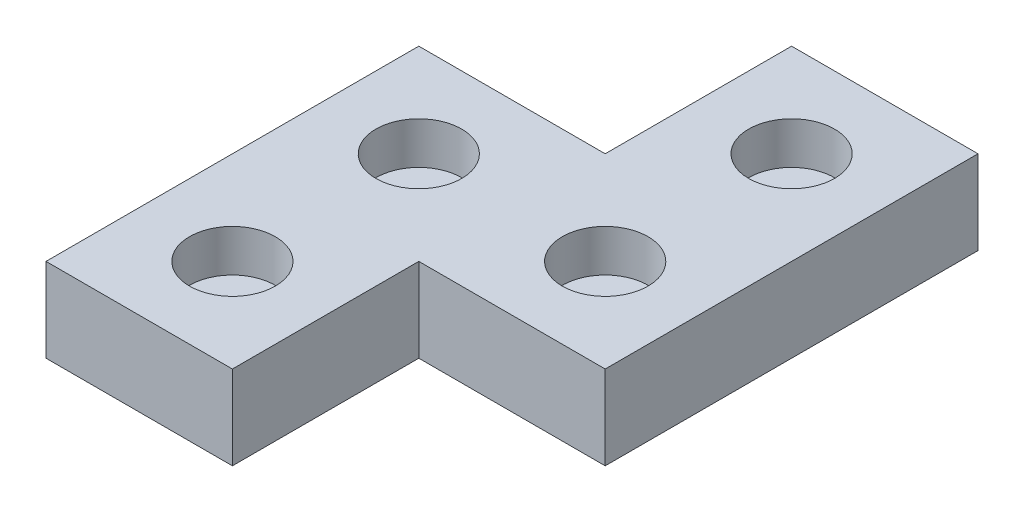
ISO-10303-21;
HEADER;
FILE_DESCRIPTION(('STEP AP214'),'2;1');
FILE_NAME('part.step','',(''),(''),'','','');
FILE_SCHEMA(('AUTOMOTIVE_DESIGN { 1 0 10303 214 1 1 1 1 }'));
ENDSEC;
DATA;
#1=APPLICATION_CONTEXT('core data for automotive mechanical design processes');
#2=APPLICATION_PROTOCOL_DEFINITION('international standard','automotive_design',2000,#1);
#3=PRODUCT_CONTEXT('',#1,'mechanical');
#4=PRODUCT('Part','Part','',(#3));
#5=PRODUCT_RELATED_PRODUCT_CATEGORY('part','',(#4));
#6=PRODUCT_DEFINITION_FORMATION('','',#4);
#7=PRODUCT_DEFINITION_CONTEXT('part definition',#1,'design');
#8=PRODUCT_DEFINITION('design','',#6,#7);
#9=PRODUCT_DEFINITION_SHAPE('','',#8);
#10=(LENGTH_UNIT() NAMED_UNIT(*) SI_UNIT(.MILLI.,.METRE.));
#11=(NAMED_UNIT(*) PLANE_ANGLE_UNIT() SI_UNIT($,.RADIAN.));
#12=(NAMED_UNIT(*) SI_UNIT($,.STERADIAN.) SOLID_ANGLE_UNIT());
#13=UNCERTAINTY_MEASURE_WITH_UNIT(LENGTH_MEASURE(1.E-05),#10,'distance_accuracy_value','');
#14=(GEOMETRIC_REPRESENTATION_CONTEXT(3) GLOBAL_UNCERTAINTY_ASSIGNED_CONTEXT((#13)) GLOBAL_UNIT_ASSIGNED_CONTEXT((#10,
#11,#12)) REPRESENTATION_CONTEXT('',''));
#15=CARTESIAN_POINT('',(0.,0.,0.));
#16=DIRECTION('',(0.,0.,1.));
#17=DIRECTION('',(1.,0.,0.));
#18=AXIS2_PLACEMENT_3D('',#15,#16,#17);
#19=CARTESIAN_POINT('',(-55.0675765364658,5.715,9.80298613010364));
#20=DIRECTION('',(0.,0.,1.));
#21=DIRECTION('',(-1.,0.,0.));
#22=AXIS2_PLACEMENT_3D('',#19,#20,#21);
#23=PLANE('',#22);
#24=DIRECTION('',(1.,0.,0.));
#25=VECTOR('',#24,1.);
#26=CARTESIAN_POINT('',(-55.0675765364658,0.,9.80298613010364));
#27=LINE('',#26,#25);
#28=CARTESIAN_POINT('',(-55.0675765364658,0.,9.80298613010364));
#29=VERTEX_POINT('',#28);
#30=CARTESIAN_POINT('',(-42.3675765364658,0.,9.80298613010364));
#31=VERTEX_POINT('',#30);
#32=EDGE_CURVE('E135',#29,#31,#27,.T.);
#33=ORIENTED_EDGE('',*,*,#32,.T.);
#34=DIRECTION('',(0.,-1.,0.));
#35=VECTOR('',#34,1.);
#36=CARTESIAN_POINT('',(-42.3675765364658,5.715,9.80298613010364));
#37=LINE('',#36,#35);
#38=CARTESIAN_POINT('',(-42.3675765364658,5.715,9.80298613010364));
#39=VERTEX_POINT('',#38);
#40=EDGE_CURVE('E42',#39,#31,#37,.T.);
#41=ORIENTED_EDGE('',*,*,#40,.F.);
#42=DIRECTION('',(1.,0.,0.));
#43=VECTOR('',#42,1.);
#44=CARTESIAN_POINT('',(-55.0675765364658,5.715,9.80298613010364));
#45=LINE('',#44,#43);
#46=CARTESIAN_POINT('',(-55.0675765364658,5.715,9.80298613010364));
#47=VERTEX_POINT('',#46);
#48=EDGE_CURVE('E149',#47,#39,#45,.T.);
#49=ORIENTED_EDGE('',*,*,#48,.F.);
#50=DIRECTION('',(0.,-1.,0.));
#51=VECTOR('',#50,1.);
#52=CARTESIAN_POINT('',(-55.0675765364658,5.715,9.80298613010364));
#53=LINE('',#52,#51);
#54=EDGE_CURVE('E11',#47,#29,#53,.T.);
#55=ORIENTED_EDGE('',*,*,#54,.T.);
#56=EDGE_LOOP('',(#33,#41,#49,#55));
#57=FACE_BOUND('',#56,.T.);
#58=ADVANCED_FACE('F39',(#57),#23,.T.);
#59=CARTESIAN_POINT('',(-55.0675765364658,5.715,22.5029861301036));
#60=DIRECTION('',(1.,0.,0.));
#61=DIRECTION('',(0.,0.,1.));
#62=AXIS2_PLACEMENT_3D('',#59,#60,#61);
#63=PLANE('',#62);
#64=DIRECTION('',(0.,0.,-1.));
#65=VECTOR('',#64,1.);
#66=CARTESIAN_POINT('',(-55.0675765364658,0.,22.5029861301036));
#67=LINE('',#66,#65);
#68=CARTESIAN_POINT('',(-55.0675765364658,0.,22.5029861301036));
#69=VERTEX_POINT('',#68);
#70=EDGE_CURVE('E92',#69,#29,#67,.T.);
#71=ORIENTED_EDGE('',*,*,#70,.T.);
#72=ORIENTED_EDGE('',*,*,#54,.F.);
#73=DIRECTION('',(0.,0.,-1.));
#74=VECTOR('',#73,1.);
#75=CARTESIAN_POINT('',(-55.0675765364658,5.715,22.5029861301036));
#76=LINE('',#75,#74);
#77=CARTESIAN_POINT('',(-55.0675765364658,5.715,22.5029861301036));
#78=VERTEX_POINT('',#77);
#79=EDGE_CURVE('E57',#78,#47,#76,.T.);
#80=ORIENTED_EDGE('',*,*,#79,.F.);
#81=DIRECTION('',(0.,-1.,0.));
#82=VECTOR('',#81,1.);
#83=CARTESIAN_POINT('',(-55.0675765364658,5.715,22.5029861301036));
#84=LINE('',#83,#82);
#85=EDGE_CURVE('E48',#78,#69,#84,.T.);
#86=ORIENTED_EDGE('',*,*,#85,.T.);
#87=EDGE_LOOP('',(#71,#72,#80,#86));
#88=FACE_BOUND('',#87,.T.);
#89=ADVANCED_FACE('F221',(#88),#63,.T.);
#90=CARTESIAN_POINT('',(-67.7675765364658,5.715,22.5029861301036));
#91=DIRECTION('',(0.,0.,1.));
#92=DIRECTION('',(-1.,0.,0.));
#93=AXIS2_PLACEMENT_3D('',#90,#91,#92);
#94=PLANE('',#93);
#95=DIRECTION('',(1.,0.,0.));
#96=VECTOR('',#95,1.);
#97=CARTESIAN_POINT('',(-67.7675765364658,0.,22.5029861301036));
#98=LINE('',#97,#96);
#99=CARTESIAN_POINT('',(-67.7675765364658,0.,22.5029861301036));
#100=VERTEX_POINT('',#99);
#101=EDGE_CURVE('E86',#100,#69,#98,.T.);
#102=ORIENTED_EDGE('',*,*,#101,.T.);
#103=ORIENTED_EDGE('',*,*,#85,.F.);
#104=DIRECTION('',(1.,0.,0.));
#105=VECTOR('',#104,1.);
#106=CARTESIAN_POINT('',(-67.7675765364658,5.715,22.5029861301036));
#107=LINE('',#106,#105);
#108=CARTESIAN_POINT('',(-67.7675765364658,5.715,22.5029861301036));
#109=VERTEX_POINT('',#108);
#110=EDGE_CURVE('E117',#109,#78,#107,.T.);
#111=ORIENTED_EDGE('',*,*,#110,.F.);
#112=DIRECTION('',(0.,-1.,0.));
#113=VECTOR('',#112,1.);
#114=CARTESIAN_POINT('',(-67.7675765364658,5.715,22.5029861301036));
#115=LINE('',#114,#113);
#116=EDGE_CURVE('E124',#109,#100,#115,.T.);
#117=ORIENTED_EDGE('',*,*,#116,.T.);
#118=EDGE_LOOP('',(#102,#103,#111,#117));
#119=FACE_BOUND('',#118,.T.);
#120=ADVANCED_FACE('F130',(#119),#94,.T.);
#121=CARTESIAN_POINT('',(-67.7675765364658,5.715,-2.89701386989635));
#122=DIRECTION('',(-1.,0.,0.));
#123=DIRECTION('',(0.,0.,-1.));
#124=AXIS2_PLACEMENT_3D('',#121,#122,#123);
#125=PLANE('',#124);
#126=DIRECTION('',(0.,0.,1.));
#127=VECTOR('',#126,1.);
#128=CARTESIAN_POINT('',(-67.7675765364658,0.,-2.89701386989635));
#129=LINE('',#128,#127);
#130=CARTESIAN_POINT('',(-67.7675765364658,0.,-2.89701386989635));
#131=VERTEX_POINT('',#130);
#132=EDGE_CURVE('E127',#131,#100,#129,.T.);
#133=ORIENTED_EDGE('',*,*,#132,.T.);
#134=ORIENTED_EDGE('',*,*,#116,.F.);
#135=DIRECTION('',(0.,0.,1.));
#136=VECTOR('',#135,1.);
#137=CARTESIAN_POINT('',(-67.7675765364658,5.715,-2.89701386989635));
#138=LINE('',#137,#136);
#139=CARTESIAN_POINT('',(-67.7675765364658,5.715,-2.89701386989635));
#140=VERTEX_POINT('',#139);
#141=EDGE_CURVE('E113',#140,#109,#138,.T.);
#142=ORIENTED_EDGE('',*,*,#141,.F.);
#143=DIRECTION('',(0.,-1.,0.));
#144=VECTOR('',#143,1.);
#145=CARTESIAN_POINT('',(-67.7675765364658,5.715,-2.89701386989635));
#146=LINE('',#145,#144);
#147=EDGE_CURVE('E128',#140,#131,#146,.T.);
#148=ORIENTED_EDGE('',*,*,#147,.T.);
#149=EDGE_LOOP('',(#133,#134,#142,#148));
#150=FACE_BOUND('',#149,.T.);
#151=ADVANCED_FACE('F125',(#150),#125,.T.);
#152=CARTESIAN_POINT('',(-55.0675765364658,5.715,-2.89701386989635));
#153=DIRECTION('',(0.,0.,-1.));
#154=DIRECTION('',(1.,0.,0.));
#155=AXIS2_PLACEMENT_3D('',#152,#153,#154);
#156=PLANE('',#155);
#157=DIRECTION('',(-1.,0.,0.));
#158=VECTOR('',#157,1.);
#159=CARTESIAN_POINT('',(-55.0675765364658,0.,-2.89701386989635));
#160=LINE('',#159,#158);
#161=CARTESIAN_POINT('',(-55.0675765364658,0.,-2.89701386989635));
#162=VERTEX_POINT('',#161);
#163=EDGE_CURVE('E145',#162,#131,#160,.T.);
#164=ORIENTED_EDGE('',*,*,#163,.T.);
#165=ORIENTED_EDGE('',*,*,#147,.F.);
#166=DIRECTION('',(-1.,0.,0.));
#167=VECTOR('',#166,1.);
#168=CARTESIAN_POINT('',(-55.0675765364658,5.715,-2.89701386989635));
#169=LINE('',#168,#167);
#170=CARTESIAN_POINT('',(-55.0675765364658,5.715,-2.89701386989635));
#171=VERTEX_POINT('',#170);
#172=EDGE_CURVE('E119',#171,#140,#169,.T.);
#173=ORIENTED_EDGE('',*,*,#172,.F.);
#174=DIRECTION('',(0.,-1.,0.));
#175=VECTOR('',#174,1.);
#176=CARTESIAN_POINT('',(-55.0675765364658,5.715,-2.89701386989635));
#177=LINE('',#176,#175);
#178=EDGE_CURVE('E153',#171,#162,#177,.T.);
#179=ORIENTED_EDGE('',*,*,#178,.T.);
#180=EDGE_LOOP('',(#164,#165,#173,#179));
#181=FACE_BOUND('',#180,.T.);
#182=ADVANCED_FACE('F235',(#181),#156,.T.);
#183=CARTESIAN_POINT('',(-55.0675765364658,5.715,-15.5970138698964));
#184=DIRECTION('',(-1.,0.,0.));
#185=DIRECTION('',(0.,0.,-1.));
#186=AXIS2_PLACEMENT_3D('',#183,#184,#185);
#187=PLANE('',#186);
#188=DIRECTION('',(0.,0.,1.));
#189=VECTOR('',#188,1.);
#190=CARTESIAN_POINT('',(-55.0675765364658,0.,-15.5970138698964));
#191=LINE('',#190,#189);
#192=CARTESIAN_POINT('',(-55.0675765364658,0.,-15.5970138698964));
#193=VERTEX_POINT('',#192);
#194=EDGE_CURVE('E143',#193,#162,#191,.T.);
#195=ORIENTED_EDGE('',*,*,#194,.T.);
#196=ORIENTED_EDGE('',*,*,#178,.F.);
#197=DIRECTION('',(0.,0.,1.));
#198=VECTOR('',#197,1.);
#199=CARTESIAN_POINT('',(-55.0675765364658,5.715,-15.5970138698964));
#200=LINE('',#199,#198);
#201=CARTESIAN_POINT('',(-55.0675765364658,5.715,-15.5970138698964));
#202=VERTEX_POINT('',#201);
#203=EDGE_CURVE('E178',#202,#171,#200,.T.);
#204=ORIENTED_EDGE('',*,*,#203,.F.);
#205=DIRECTION('',(0.,-1.,0.));
#206=VECTOR('',#205,1.);
#207=CARTESIAN_POINT('',(-55.0675765364658,5.715,-15.5970138698964));
#208=LINE('',#207,#206);
#209=EDGE_CURVE('E156',#202,#193,#208,.T.);
#210=ORIENTED_EDGE('',*,*,#209,.T.);
#211=EDGE_LOOP('',(#195,#196,#204,#210));
#212=FACE_BOUND('',#211,.T.);
#213=ADVANCED_FACE('F176',(#212),#187,.T.);
#214=CARTESIAN_POINT('',(-42.3675765364658,5.715,-15.5970138698964));
#215=DIRECTION('',(0.,0.,-1.));
#216=DIRECTION('',(1.,0.,0.));
#217=AXIS2_PLACEMENT_3D('',#214,#215,#216);
#218=PLANE('',#217);
#219=DIRECTION('',(-1.,0.,0.));
#220=VECTOR('',#219,1.);
#221=CARTESIAN_POINT('',(-42.3675765364658,0.,-15.5970138698964));
#222=LINE('',#221,#220);
#223=CARTESIAN_POINT('',(-42.3675765364658,0.,-15.5970138698964));
#224=VERTEX_POINT('',#223);
#225=EDGE_CURVE('E141',#224,#193,#222,.T.);
#226=ORIENTED_EDGE('',*,*,#225,.T.);
#227=ORIENTED_EDGE('',*,*,#209,.F.);
#228=DIRECTION('',(-1.,0.,0.));
#229=VECTOR('',#228,1.);
#230=CARTESIAN_POINT('',(-42.3675765364658,5.715,-15.5970138698964));
#231=LINE('',#230,#229);
#232=CARTESIAN_POINT('',(-42.3675765364658,5.715,-15.5970138698964));
#233=VERTEX_POINT('',#232);
#234=EDGE_CURVE('E179',#233,#202,#231,.T.);
#235=ORIENTED_EDGE('',*,*,#234,.F.);
#236=DIRECTION('',(0.,-1.,0.));
#237=VECTOR('',#236,1.);
#238=CARTESIAN_POINT('',(-42.3675765364658,5.715,-15.5970138698964));
#239=LINE('',#238,#237);
#240=EDGE_CURVE('E158',#233,#224,#239,.T.);
#241=ORIENTED_EDGE('',*,*,#240,.T.);
#242=EDGE_LOOP('',(#226,#227,#235,#241));
#243=FACE_BOUND('',#242,.T.);
#244=ADVANCED_FACE('F173',(#243),#218,.T.);
#245=CARTESIAN_POINT('',(-42.3675765364658,5.715,9.80298613010364));
#246=DIRECTION('',(1.,0.,0.));
#247=DIRECTION('',(0.,0.,1.));
#248=AXIS2_PLACEMENT_3D('',#245,#246,#247);
#249=PLANE('',#248);
#250=DIRECTION('',(0.,0.,-1.));
#251=VECTOR('',#250,1.);
#252=CARTESIAN_POINT('',(-42.3675765364658,0.,9.80298613010364));
#253=LINE('',#252,#251);
#254=EDGE_CURVE('E138',#31,#224,#253,.T.);
#255=ORIENTED_EDGE('',*,*,#254,.T.);
#256=ORIENTED_EDGE('',*,*,#240,.F.);
#257=DIRECTION('',(0.,0.,-1.));
#258=VECTOR('',#257,1.);
#259=CARTESIAN_POINT('',(-42.3675765364658,5.715,9.80298613010364));
#260=LINE('',#259,#258);
#261=EDGE_CURVE('E100',#39,#233,#260,.T.);
#262=ORIENTED_EDGE('',*,*,#261,.F.);
#263=ORIENTED_EDGE('',*,*,#40,.T.);
#264=EDGE_LOOP('',(#255,#256,#262,#263));
#265=FACE_BOUND('',#264,.T.);
#266=ADVANCED_FACE('F164',(#265),#249,.T.);
#267=CARTESIAN_POINT('',(-55.0675765364658,5.715,0.));
#268=DIRECTION('',(0.,-1.,0.));
#269=DIRECTION('',(0.,0.,-1.));
#270=AXIS2_PLACEMENT_3D('',#267,#268,#269);
#271=PLANE('',#270);
#272=CARTESIAN_POINT('',(-48.7175765364658,5.715,-9.24701386989635));
#273=DIRECTION('',(0.,-1.,0.));
#274=DIRECTION('',(0.,0.,1.));
#275=AXIS2_PLACEMENT_3D('',#272,#273,#274);
#276=CIRCLE('',#275,2.921);
#277=CARTESIAN_POINT('',(-48.7175765364658,5.715,-6.32601386989635));
#278=VERTEX_POINT('',#277);
#279=EDGE_CURVE('E198',#278,#278,#276,.T.);
#280=ORIENTED_EDGE('',*,*,#279,.T.);
#281=EDGE_LOOP('',(#280));
#282=FACE_BOUND('',#281,.T.);
#283=CARTESIAN_POINT('',(-61.4175765364658,5.715,3.45298613010364));
#284=DIRECTION('',(0.,-1.,0.));
#285=DIRECTION('',(0.,0.,1.));
#286=AXIS2_PLACEMENT_3D('',#283,#284,#285);
#287=CIRCLE('',#286,2.921);
#288=CARTESIAN_POINT('',(-61.4175765364658,5.715,6.37398613010364));
#289=VERTEX_POINT('',#288);
#290=EDGE_CURVE('E199',#289,#289,#287,.T.);
#291=ORIENTED_EDGE('',*,*,#290,.T.);
#292=EDGE_LOOP('',(#291));
#293=FACE_BOUND('',#292,.T.);
#294=CARTESIAN_POINT('',(-48.7175765364658,5.715,3.45298613010364));
#295=DIRECTION('',(0.,-1.,0.));
#296=DIRECTION('',(0.,0.,1.));
#297=AXIS2_PLACEMENT_3D('',#294,#295,#296);
#298=CIRCLE('',#297,2.921);
#299=CARTESIAN_POINT('',(-48.7175765364658,5.715,6.37398613010364));
#300=VERTEX_POINT('',#299);
#301=EDGE_CURVE('E185',#300,#300,#298,.T.);
#302=ORIENTED_EDGE('',*,*,#301,.T.);
#303=EDGE_LOOP('',(#302));
#304=FACE_BOUND('',#303,.T.);
#305=CARTESIAN_POINT('',(-61.4175765364658,5.715,16.1529861301036));
#306=DIRECTION('',(0.,-1.,0.));
#307=DIRECTION('',(0.,0.,1.));
#308=AXIS2_PLACEMENT_3D('',#305,#306,#307);
#309=CIRCLE('',#308,2.921);
#310=CARTESIAN_POINT('',(-61.4175765364658,5.715,19.0739861301036));
#311=VERTEX_POINT('',#310);
#312=EDGE_CURVE('E192',#311,#311,#309,.T.);
#313=ORIENTED_EDGE('',*,*,#312,.T.);
#314=EDGE_LOOP('',(#313));
#315=FACE_BOUND('',#314,.T.);
#316=ORIENTED_EDGE('',*,*,#48,.T.);
#317=ORIENTED_EDGE('',*,*,#261,.T.);
#318=ORIENTED_EDGE('',*,*,#234,.T.);
#319=ORIENTED_EDGE('',*,*,#203,.T.);
#320=ORIENTED_EDGE('',*,*,#172,.T.);
#321=ORIENTED_EDGE('',*,*,#141,.T.);
#322=ORIENTED_EDGE('',*,*,#110,.T.);
#323=ORIENTED_EDGE('',*,*,#79,.T.);
#324=EDGE_LOOP('',(#316,#317,#318,#319,#320,#321,#322,#323));
#325=FACE_BOUND('',#324,.T.);
#326=ADVANCED_FACE('F115',(#282,#293,#304,#315,#325),#271,.F.);
#327=CARTESIAN_POINT('',(-55.0675765364658,0.,0.));
#328=DIRECTION('',(0.,-1.,0.));
#329=DIRECTION('',(0.,0.,-1.));
#330=AXIS2_PLACEMENT_3D('',#327,#328,#329);
#331=PLANE('',#330);
#332=ORIENTED_EDGE('',*,*,#32,.F.);
#333=ORIENTED_EDGE('',*,*,#70,.F.);
#334=ORIENTED_EDGE('',*,*,#101,.F.);
#335=ORIENTED_EDGE('',*,*,#132,.F.);
#336=ORIENTED_EDGE('',*,*,#163,.F.);
#337=ORIENTED_EDGE('',*,*,#194,.F.);
#338=ORIENTED_EDGE('',*,*,#225,.F.);
#339=ORIENTED_EDGE('',*,*,#254,.F.);
#340=EDGE_LOOP('',(#332,#333,#334,#335,#336,#337,#338,#339));
#341=FACE_BOUND('',#340,.T.);
#342=ADVANCED_FACE('F169',(#341),#331,.T.);
#343=CARTESIAN_POINT('',(-61.4175765364658,2.8448,16.1529861301036));
#344=DIRECTION('',(0.,1.,0.));
#345=DIRECTION('',(0.,0.,1.));
#346=AXIS2_PLACEMENT_3D('',#343,#344,#345);
#347=CYLINDRICAL_SURFACE('',#346,2.921);
#348=CARTESIAN_POINT('',(-61.4175765364658,2.8448,16.1529861301036));
#349=DIRECTION('',(0.,-1.,0.));
#350=DIRECTION('',(0.,0.,1.));
#351=AXIS2_PLACEMENT_3D('',#348,#349,#350);
#352=CIRCLE('',#351,2.921);
#353=CARTESIAN_POINT('',(-61.4175765364658,2.8448,19.0739861301036));
#354=VERTEX_POINT('',#353);
#355=EDGE_CURVE('E195',#354,#354,#352,.T.);
#356=CARTESIAN_POINT('',(-61.4175765364658,2.8448,19.0739861301036));
#357=CARTESIAN_POINT('',(-61.4175765364658,2.87469791666667,19.0739861301036));
#358=CARTESIAN_POINT('',(-61.4175765364658,2.90459583333333,19.0739861301036));
#359=CARTESIAN_POINT('',(-61.4175765364658,2.96439166666667,19.0739861301036));
#360=CARTESIAN_POINT('',(-61.4175765364658,2.99428958333333,19.0739861301036));
#361=CARTESIAN_POINT('',(-61.4175765364658,3.05408541666667,19.0739861301036));
#362=CARTESIAN_POINT('',(-61.4175765364658,3.08398333333333,19.0739861301036));
#363=CARTESIAN_POINT('',(-61.4175765364658,3.14377916666667,19.0739861301036));
#364=CARTESIAN_POINT('',(-61.4175765364658,3.17367708333333,19.0739861301036));
#365=CARTESIAN_POINT('',(-61.4175765364658,3.23347291666667,19.0739861301036));
#366=CARTESIAN_POINT('',(-61.4175765364658,3.26337083333333,19.0739861301036));
#367=CARTESIAN_POINT('',(-61.4175765364658,3.32316666666667,19.0739861301036));
#368=CARTESIAN_POINT('',(-61.4175765364658,3.35306458333333,19.0739861301036));
#369=CARTESIAN_POINT('',(-61.4175765364658,3.41286041666667,19.0739861301036));
#370=CARTESIAN_POINT('',(-61.4175765364658,3.44275833333333,19.0739861301036));
#371=CARTESIAN_POINT('',(-61.4175765364658,3.50255416666667,19.0739861301036));
#372=CARTESIAN_POINT('',(-61.4175765364658,3.53245208333333,19.0739861301036));
#373=CARTESIAN_POINT('',(-61.4175765364658,3.59224791666667,19.0739861301036));
#374=CARTESIAN_POINT('',(-61.4175765364658,3.62214583333333,19.0739861301036));
#375=CARTESIAN_POINT('',(-61.4175765364658,3.68194166666667,19.0739861301036));
#376=CARTESIAN_POINT('',(-61.4175765364658,3.71183958333333,19.0739861301036));
#377=CARTESIAN_POINT('',(-61.4175765364658,3.77163541666667,19.0739861301036));
#378=CARTESIAN_POINT('',(-61.4175765364658,3.80153333333333,19.0739861301036));
#379=CARTESIAN_POINT('',(-61.4175765364658,3.86132916666667,19.0739861301036));
#380=CARTESIAN_POINT('',(-61.4175765364658,3.89122708333333,19.0739861301036));
#381=CARTESIAN_POINT('',(-61.4175765364658,3.95102291666667,19.0739861301036));
#382=CARTESIAN_POINT('',(-61.4175765364658,3.98092083333333,19.0739861301036));
#383=CARTESIAN_POINT('',(-61.4175765364658,4.04071666666667,19.0739861301036));
#384=CARTESIAN_POINT('',(-61.4175765364658,4.07061458333333,19.0739861301036));
#385=CARTESIAN_POINT('',(-61.4175765364658,4.13041041666667,19.0739861301036));
#386=CARTESIAN_POINT('',(-61.4175765364658,4.16030833333333,19.0739861301036));
#387=CARTESIAN_POINT('',(-61.4175765364658,4.22010416666667,19.0739861301036));
#388=CARTESIAN_POINT('',(-61.4175765364658,4.25000208333333,19.0739861301036));
#389=CARTESIAN_POINT('',(-61.4175765364658,4.30979791666667,19.0739861301036));
#390=CARTESIAN_POINT('',(-61.4175765364658,4.33969583333333,19.0739861301036));
#391=CARTESIAN_POINT('',(-61.4175765364658,4.39949166666667,19.0739861301036));
#392=CARTESIAN_POINT('',(-61.4175765364658,4.42938958333333,19.0739861301036));
#393=CARTESIAN_POINT('',(-61.4175765364658,4.48918541666667,19.0739861301036));
#394=CARTESIAN_POINT('',(-61.4175765364658,4.51908333333333,19.0739861301036));
#395=CARTESIAN_POINT('',(-61.4175765364658,4.57887916666667,19.0739861301036));
#396=CARTESIAN_POINT('',(-61.4175765364658,4.60877708333333,19.0739861301036));
#397=CARTESIAN_POINT('',(-61.4175765364658,4.66857291666667,19.0739861301036));
#398=CARTESIAN_POINT('',(-61.4175765364658,4.69847083333333,19.0739861301036));
#399=CARTESIAN_POINT('',(-61.4175765364658,4.75826666666667,19.0739861301036));
#400=CARTESIAN_POINT('',(-61.4175765364658,4.78816458333333,19.0739861301036));
#401=CARTESIAN_POINT('',(-61.4175765364658,4.84796041666667,19.0739861301036));
#402=CARTESIAN_POINT('',(-61.4175765364658,4.87785833333333,19.0739861301036));
#403=CARTESIAN_POINT('',(-61.4175765364658,4.93765416666667,19.0739861301036));
#404=CARTESIAN_POINT('',(-61.4175765364658,4.96755208333333,19.0739861301036));
#405=CARTESIAN_POINT('',(-61.4175765364658,5.02734791666667,19.0739861301036));
#406=CARTESIAN_POINT('',(-61.4175765364658,5.05724583333333,19.0739861301036));
#407=CARTESIAN_POINT('',(-61.4175765364658,5.11704166666667,19.0739861301036));
#408=CARTESIAN_POINT('',(-61.4175765364658,5.14693958333333,19.0739861301036));
#409=CARTESIAN_POINT('',(-61.4175765364658,5.20673541666667,19.0739861301036));
#410=CARTESIAN_POINT('',(-61.4175765364658,5.23663333333333,19.0739861301036));
#411=CARTESIAN_POINT('',(-61.4175765364658,5.29642916666667,19.0739861301036));
#412=CARTESIAN_POINT('',(-61.4175765364658,5.32632708333333,19.0739861301036));
#413=CARTESIAN_POINT('',(-61.4175765364658,5.38612291666667,19.0739861301036));
#414=CARTESIAN_POINT('',(-61.4175765364658,5.41602083333333,19.0739861301036));
#415=CARTESIAN_POINT('',(-61.4175765364658,5.47581666666667,19.0739861301036));
#416=CARTESIAN_POINT('',(-61.4175765364658,5.50571458333333,19.0739861301036));
#417=CARTESIAN_POINT('',(-61.4175765364658,5.56551041666667,19.0739861301036));
#418=CARTESIAN_POINT('',(-61.4175765364658,5.59540833333333,19.0739861301036));
#419=CARTESIAN_POINT('',(-61.4175765364658,5.65520416666667,19.0739861301036));
#420=CARTESIAN_POINT('',(-61.4175765364658,5.68510208333333,19.0739861301036));
#421=CARTESIAN_POINT('',(-61.4175765364658,5.715,19.0739861301036));
#422=B_SPLINE_CURVE_WITH_KNOTS('',3,(#356,#357,#358,#359,#360,#361,#362,#363,#364,#365,#366,
#367,#368,#369,#370,#371,#372,#373,#374,#375,#376,#377,#378,#379,#380,#381,#382,#383,#384,#385,
#386,#387,#388,#389,#390,#391,#392,#393,#394,#395,#396,#397,#398,#399,#400,#401,#402,#403,#404,
#405,#406,#407,#408,#409,#410,#411,#412,#413,#414,#415,#416,#417,#418,#419,#420,#421),
.UNSPECIFIED.,.F.,.F.,(4,2,2,2,2,2,2,2,2,2,2,2,2,2,2,2,2,2,2,2,2,2,2,2,2,2,2,2,2,2,2,2,4),(0.,
0.0896937500000001,0.1793875,0.26908125,0.358775,0.44846875,0.5381625,0.62785625,0.71755,
0.80724375,0.8969375,0.98663125,1.076325,1.16601875,1.2557125,1.34540625,1.4351,1.52479375,
1.6144875,1.70418125,1.793875,1.88356875,1.9732625,2.06295625,2.15265,2.24234375,2.3320375,
2.42173125,2.511425,2.60111875,2.6908125,2.78050625,2.8702),.UNSPECIFIED.);
#423=EDGE_CURVE('BSEAM250',#354,#311,#422,.T.);
#424=ORIENTED_EDGE('',*,*,#355,.T.);
#425=ORIENTED_EDGE('',*,*,#312,.F.);
#426=ORIENTED_EDGE('',*,*,#423,.T.);
#427=ORIENTED_EDGE('',*,*,#423,.F.);
#428=EDGE_LOOP('',(#424,#426,#425,#427));
#429=FACE_BOUND('',#428,.T.);
#430=ADVANCED_FACE('F250',(#429),#347,.F.);
#431=CARTESIAN_POINT('',(-61.4175765364658,2.8448,16.1529861301036));
#432=DIRECTION('',(0.,1.,0.));
#433=DIRECTION('',(0.,0.,1.));
#434=AXIS2_PLACEMENT_3D('',#431,#432,#433);
#435=PLANE('',#434);
#436=ORIENTED_EDGE('',*,*,#355,.F.);
#437=EDGE_LOOP('',(#436));
#438=FACE_BOUND('',#437,.T.);
#439=ADVANCED_FACE('F257',(#438),#435,.T.);
#440=CARTESIAN_POINT('',(-48.7175765364658,2.8448,3.45298613010364));
#441=DIRECTION('',(0.,1.,0.));
#442=DIRECTION('',(0.,0.,1.));
#443=AXIS2_PLACEMENT_3D('',#440,#441,#442);
#444=CYLINDRICAL_SURFACE('',#443,2.921);
#445=CARTESIAN_POINT('',(-48.7175765364658,2.8448,3.45298613010364));
#446=DIRECTION('',(0.,-1.,0.));
#447=DIRECTION('',(0.,0.,1.));
#448=AXIS2_PLACEMENT_3D('',#445,#446,#447);
#449=CIRCLE('',#448,2.921);
#450=CARTESIAN_POINT('',(-48.7175765364658,2.8448,6.37398613010364));
#451=VERTEX_POINT('',#450);
#452=EDGE_CURVE('E188',#451,#451,#449,.T.);
#453=CARTESIAN_POINT('',(-48.7175765364658,2.8448,6.37398613010364));
#454=CARTESIAN_POINT('',(-48.7175765364658,2.87469791666667,6.37398613010364));
#455=CARTESIAN_POINT('',(-48.7175765364658,2.90459583333333,6.37398613010364));
#456=CARTESIAN_POINT('',(-48.7175765364658,2.96439166666667,6.37398613010364));
#457=CARTESIAN_POINT('',(-48.7175765364658,2.99428958333333,6.37398613010364));
#458=CARTESIAN_POINT('',(-48.7175765364658,3.05408541666667,6.37398613010364));
#459=CARTESIAN_POINT('',(-48.7175765364658,3.08398333333333,6.37398613010364));
#460=CARTESIAN_POINT('',(-48.7175765364658,3.14377916666667,6.37398613010364));
#461=CARTESIAN_POINT('',(-48.7175765364658,3.17367708333333,6.37398613010364));
#462=CARTESIAN_POINT('',(-48.7175765364658,3.23347291666667,6.37398613010364));
#463=CARTESIAN_POINT('',(-48.7175765364658,3.26337083333333,6.37398613010364));
#464=CARTESIAN_POINT('',(-48.7175765364658,3.32316666666667,6.37398613010364));
#465=CARTESIAN_POINT('',(-48.7175765364658,3.35306458333333,6.37398613010364));
#466=CARTESIAN_POINT('',(-48.7175765364658,3.41286041666667,6.37398613010364));
#467=CARTESIAN_POINT('',(-48.7175765364658,3.44275833333333,6.37398613010364));
#468=CARTESIAN_POINT('',(-48.7175765364658,3.50255416666667,6.37398613010364));
#469=CARTESIAN_POINT('',(-48.7175765364658,3.53245208333333,6.37398613010364));
#470=CARTESIAN_POINT('',(-48.7175765364658,3.59224791666667,6.37398613010364));
#471=CARTESIAN_POINT('',(-48.7175765364658,3.62214583333333,6.37398613010364));
#472=CARTESIAN_POINT('',(-48.7175765364658,3.68194166666667,6.37398613010364));
#473=CARTESIAN_POINT('',(-48.7175765364658,3.71183958333333,6.37398613010364));
#474=CARTESIAN_POINT('',(-48.7175765364658,3.77163541666667,6.37398613010364));
#475=CARTESIAN_POINT('',(-48.7175765364658,3.80153333333333,6.37398613010364));
#476=CARTESIAN_POINT('',(-48.7175765364658,3.86132916666667,6.37398613010364));
#477=CARTESIAN_POINT('',(-48.7175765364658,3.89122708333333,6.37398613010364));
#478=CARTESIAN_POINT('',(-48.7175765364658,3.95102291666667,6.37398613010364));
#479=CARTESIAN_POINT('',(-48.7175765364658,3.98092083333333,6.37398613010364));
#480=CARTESIAN_POINT('',(-48.7175765364658,4.04071666666667,6.37398613010364));
#481=CARTESIAN_POINT('',(-48.7175765364658,4.07061458333333,6.37398613010364));
#482=CARTESIAN_POINT('',(-48.7175765364658,4.13041041666667,6.37398613010364));
#483=CARTESIAN_POINT('',(-48.7175765364658,4.16030833333333,6.37398613010364));
#484=CARTESIAN_POINT('',(-48.7175765364658,4.22010416666667,6.37398613010364));
#485=CARTESIAN_POINT('',(-48.7175765364658,4.25000208333333,6.37398613010364));
#486=CARTESIAN_POINT('',(-48.7175765364658,4.30979791666667,6.37398613010364));
#487=CARTESIAN_POINT('',(-48.7175765364658,4.33969583333333,6.37398613010364));
#488=CARTESIAN_POINT('',(-48.7175765364658,4.39949166666667,6.37398613010364));
#489=CARTESIAN_POINT('',(-48.7175765364658,4.42938958333333,6.37398613010364));
#490=CARTESIAN_POINT('',(-48.7175765364658,4.48918541666667,6.37398613010364));
#491=CARTESIAN_POINT('',(-48.7175765364658,4.51908333333333,6.37398613010364));
#492=CARTESIAN_POINT('',(-48.7175765364658,4.57887916666667,6.37398613010364));
#493=CARTESIAN_POINT('',(-48.7175765364658,4.60877708333333,6.37398613010364));
#494=CARTESIAN_POINT('',(-48.7175765364658,4.66857291666667,6.37398613010364));
#495=CARTESIAN_POINT('',(-48.7175765364658,4.69847083333333,6.37398613010364));
#496=CARTESIAN_POINT('',(-48.7175765364658,4.75826666666667,6.37398613010364));
#497=CARTESIAN_POINT('',(-48.7175765364658,4.78816458333333,6.37398613010364));
#498=CARTESIAN_POINT('',(-48.7175765364658,4.84796041666667,6.37398613010364));
#499=CARTESIAN_POINT('',(-48.7175765364658,4.87785833333333,6.37398613010364));
#500=CARTESIAN_POINT('',(-48.7175765364658,4.93765416666667,6.37398613010364));
#501=CARTESIAN_POINT('',(-48.7175765364658,4.96755208333333,6.37398613010364));
#502=CARTESIAN_POINT('',(-48.7175765364658,5.02734791666667,6.37398613010364));
#503=CARTESIAN_POINT('',(-48.7175765364658,5.05724583333333,6.37398613010364));
#504=CARTESIAN_POINT('',(-48.7175765364658,5.11704166666667,6.37398613010364));
#505=CARTESIAN_POINT('',(-48.7175765364658,5.14693958333333,6.37398613010364));
#506=CARTESIAN_POINT('',(-48.7175765364658,5.20673541666667,6.37398613010364));
#507=CARTESIAN_POINT('',(-48.7175765364658,5.23663333333333,6.37398613010364));
#508=CARTESIAN_POINT('',(-48.7175765364658,5.29642916666667,6.37398613010364));
#509=CARTESIAN_POINT('',(-48.7175765364658,5.32632708333333,6.37398613010364));
#510=CARTESIAN_POINT('',(-48.7175765364658,5.38612291666667,6.37398613010364));
#511=CARTESIAN_POINT('',(-48.7175765364658,5.41602083333333,6.37398613010364));
#512=CARTESIAN_POINT('',(-48.7175765364658,5.47581666666667,6.37398613010364));
#513=CARTESIAN_POINT('',(-48.7175765364658,5.50571458333333,6.37398613010364));
#514=CARTESIAN_POINT('',(-48.7175765364658,5.56551041666667,6.37398613010364));
#515=CARTESIAN_POINT('',(-48.7175765364658,5.59540833333333,6.37398613010364));
#516=CARTESIAN_POINT('',(-48.7175765364658,5.65520416666667,6.37398613010364));
#517=CARTESIAN_POINT('',(-48.7175765364658,5.68510208333333,6.37398613010364));
#518=CARTESIAN_POINT('',(-48.7175765364658,5.715,6.37398613010364));
#519=B_SPLINE_CURVE_WITH_KNOTS('',3,(#453,#454,#455,#456,#457,#458,#459,#460,#461,#462,#463,
#464,#465,#466,#467,#468,#469,#470,#471,#472,#473,#474,#475,#476,#477,#478,#479,#480,#481,#482,
#483,#484,#485,#486,#487,#488,#489,#490,#491,#492,#493,#494,#495,#496,#497,#498,#499,#500,#501,
#502,#503,#504,#505,#506,#507,#508,#509,#510,#511,#512,#513,#514,#515,#516,#517,#518),
.UNSPECIFIED.,.F.,.F.,(4,2,2,2,2,2,2,2,2,2,2,2,2,2,2,2,2,2,2,2,2,2,2,2,2,2,2,2,2,2,2,2,4),(0.,
0.0896937500000001,0.1793875,0.26908125,0.358775,0.44846875,0.5381625,0.62785625,0.71755,
0.80724375,0.8969375,0.98663125,1.076325,1.16601875,1.2557125,1.34540625,1.4351,1.52479375,
1.6144875,1.70418125,1.793875,1.88356875,1.9732625,2.06295625,2.15265,2.24234375,2.3320375,
2.42173125,2.511425,2.60111875,2.6908125,2.78050625,2.8702),.UNSPECIFIED.);
#520=EDGE_CURVE('BSEAM253',#451,#300,#519,.T.);
#521=ORIENTED_EDGE('',*,*,#452,.T.);
#522=ORIENTED_EDGE('',*,*,#301,.F.);
#523=ORIENTED_EDGE('',*,*,#520,.T.);
#524=ORIENTED_EDGE('',*,*,#520,.F.);
#525=EDGE_LOOP('',(#521,#523,#522,#524));
#526=FACE_BOUND('',#525,.T.);
#527=ADVANCED_FACE('F253',(#526),#444,.F.);
#528=CARTESIAN_POINT('',(-48.7175765364658,2.8448,3.45298613010364));
#529=DIRECTION('',(0.,1.,0.));
#530=DIRECTION('',(0.,0.,1.));
#531=AXIS2_PLACEMENT_3D('',#528,#529,#530);
#532=PLANE('',#531);
#533=ORIENTED_EDGE('',*,*,#452,.F.);
#534=EDGE_LOOP('',(#533));
#535=FACE_BOUND('',#534,.T.);
#536=ADVANCED_FACE('F256',(#535),#532,.T.);
#537=CARTESIAN_POINT('',(-61.4175765364658,2.8448,3.45298613010364));
#538=DIRECTION('',(0.,1.,0.));
#539=DIRECTION('',(0.,0.,1.));
#540=AXIS2_PLACEMENT_3D('',#537,#538,#539);
#541=CYLINDRICAL_SURFACE('',#540,2.921);
#542=CARTESIAN_POINT('',(-61.4175765364658,2.8448,3.45298613010364));
#543=DIRECTION('',(0.,-1.,0.));
#544=DIRECTION('',(0.,0.,1.));
#545=AXIS2_PLACEMENT_3D('',#542,#543,#544);
#546=CIRCLE('',#545,2.921);
#547=CARTESIAN_POINT('',(-61.4175765364658,2.8448,6.37398613010364));
#548=VERTEX_POINT('',#547);
#549=EDGE_CURVE('E189',#548,#548,#546,.T.);
#550=CARTESIAN_POINT('',(-61.4175765364658,2.8448,6.37398613010364));
#551=CARTESIAN_POINT('',(-61.4175765364658,2.87469791666667,6.37398613010364));
#552=CARTESIAN_POINT('',(-61.4175765364658,2.90459583333333,6.37398613010364));
#553=CARTESIAN_POINT('',(-61.4175765364658,2.96439166666667,6.37398613010364));
#554=CARTESIAN_POINT('',(-61.4175765364658,2.99428958333333,6.37398613010364));
#555=CARTESIAN_POINT('',(-61.4175765364658,3.05408541666667,6.37398613010364));
#556=CARTESIAN_POINT('',(-61.4175765364658,3.08398333333333,6.37398613010364));
#557=CARTESIAN_POINT('',(-61.4175765364658,3.14377916666667,6.37398613010364));
#558=CARTESIAN_POINT('',(-61.4175765364658,3.17367708333333,6.37398613010364));
#559=CARTESIAN_POINT('',(-61.4175765364658,3.23347291666667,6.37398613010364));
#560=CARTESIAN_POINT('',(-61.4175765364658,3.26337083333333,6.37398613010364));
#561=CARTESIAN_POINT('',(-61.4175765364658,3.32316666666667,6.37398613010364));
#562=CARTESIAN_POINT('',(-61.4175765364658,3.35306458333333,6.37398613010364));
#563=CARTESIAN_POINT('',(-61.4175765364658,3.41286041666667,6.37398613010364));
#564=CARTESIAN_POINT('',(-61.4175765364658,3.44275833333333,6.37398613010364));
#565=CARTESIAN_POINT('',(-61.4175765364658,3.50255416666667,6.37398613010364));
#566=CARTESIAN_POINT('',(-61.4175765364658,3.53245208333333,6.37398613010364));
#567=CARTESIAN_POINT('',(-61.4175765364658,3.59224791666667,6.37398613010364));
#568=CARTESIAN_POINT('',(-61.4175765364658,3.62214583333333,6.37398613010364));
#569=CARTESIAN_POINT('',(-61.4175765364658,3.68194166666667,6.37398613010364));
#570=CARTESIAN_POINT('',(-61.4175765364658,3.71183958333333,6.37398613010364));
#571=CARTESIAN_POINT('',(-61.4175765364658,3.77163541666667,6.37398613010364));
#572=CARTESIAN_POINT('',(-61.4175765364658,3.80153333333333,6.37398613010364));
#573=CARTESIAN_POINT('',(-61.4175765364658,3.86132916666667,6.37398613010364));
#574=CARTESIAN_POINT('',(-61.4175765364658,3.89122708333333,6.37398613010364));
#575=CARTESIAN_POINT('',(-61.4175765364658,3.95102291666667,6.37398613010364));
#576=CARTESIAN_POINT('',(-61.4175765364658,3.98092083333333,6.37398613010364));
#577=CARTESIAN_POINT('',(-61.4175765364658,4.04071666666667,6.37398613010364));
#578=CARTESIAN_POINT('',(-61.4175765364658,4.07061458333333,6.37398613010364));
#579=CARTESIAN_POINT('',(-61.4175765364658,4.13041041666667,6.37398613010364));
#580=CARTESIAN_POINT('',(-61.4175765364658,4.16030833333333,6.37398613010364));
#581=CARTESIAN_POINT('',(-61.4175765364658,4.22010416666667,6.37398613010364));
#582=CARTESIAN_POINT('',(-61.4175765364658,4.25000208333333,6.37398613010364));
#583=CARTESIAN_POINT('',(-61.4175765364658,4.30979791666667,6.37398613010364));
#584=CARTESIAN_POINT('',(-61.4175765364658,4.33969583333333,6.37398613010364));
#585=CARTESIAN_POINT('',(-61.4175765364658,4.39949166666667,6.37398613010364));
#586=CARTESIAN_POINT('',(-61.4175765364658,4.42938958333333,6.37398613010364));
#587=CARTESIAN_POINT('',(-61.4175765364658,4.48918541666667,6.37398613010364));
#588=CARTESIAN_POINT('',(-61.4175765364658,4.51908333333333,6.37398613010364));
#589=CARTESIAN_POINT('',(-61.4175765364658,4.57887916666667,6.37398613010364));
#590=CARTESIAN_POINT('',(-61.4175765364658,4.60877708333333,6.37398613010364));
#591=CARTESIAN_POINT('',(-61.4175765364658,4.66857291666667,6.37398613010364));
#592=CARTESIAN_POINT('',(-61.4175765364658,4.69847083333333,6.37398613010364));
#593=CARTESIAN_POINT('',(-61.4175765364658,4.75826666666667,6.37398613010364));
#594=CARTESIAN_POINT('',(-61.4175765364658,4.78816458333333,6.37398613010364));
#595=CARTESIAN_POINT('',(-61.4175765364658,4.84796041666667,6.37398613010364));
#596=CARTESIAN_POINT('',(-61.4175765364658,4.87785833333333,6.37398613010364));
#597=CARTESIAN_POINT('',(-61.4175765364658,4.93765416666667,6.37398613010364));
#598=CARTESIAN_POINT('',(-61.4175765364658,4.96755208333333,6.37398613010364));
#599=CARTESIAN_POINT('',(-61.4175765364658,5.02734791666667,6.37398613010364));
#600=CARTESIAN_POINT('',(-61.4175765364658,5.05724583333333,6.37398613010364));
#601=CARTESIAN_POINT('',(-61.4175765364658,5.11704166666667,6.37398613010364));
#602=CARTESIAN_POINT('',(-61.4175765364658,5.14693958333333,6.37398613010364));
#603=CARTESIAN_POINT('',(-61.4175765364658,5.20673541666667,6.37398613010364));
#604=CARTESIAN_POINT('',(-61.4175765364658,5.23663333333333,6.37398613010364));
#605=CARTESIAN_POINT('',(-61.4175765364658,5.29642916666667,6.37398613010364));
#606=CARTESIAN_POINT('',(-61.4175765364658,5.32632708333333,6.37398613010364));
#607=CARTESIAN_POINT('',(-61.4175765364658,5.38612291666667,6.37398613010364));
#608=CARTESIAN_POINT('',(-61.4175765364658,5.41602083333333,6.37398613010364));
#609=CARTESIAN_POINT('',(-61.4175765364658,5.47581666666667,6.37398613010364));
#610=CARTESIAN_POINT('',(-61.4175765364658,5.50571458333333,6.37398613010364));
#611=CARTESIAN_POINT('',(-61.4175765364658,5.56551041666667,6.37398613010364));
#612=CARTESIAN_POINT('',(-61.4175765364658,5.59540833333333,6.37398613010364));
#613=CARTESIAN_POINT('',(-61.4175765364658,5.65520416666667,6.37398613010364));
#614=CARTESIAN_POINT('',(-61.4175765364658,5.68510208333333,6.37398613010364));
#615=CARTESIAN_POINT('',(-61.4175765364658,5.715,6.37398613010364));
#616=B_SPLINE_CURVE_WITH_KNOTS('',3,(#550,#551,#552,#553,#554,#555,#556,#557,#558,#559,#560,
#561,#562,#563,#564,#565,#566,#567,#568,#569,#570,#571,#572,#573,#574,#575,#576,#577,#578,#579,
#580,#581,#582,#583,#584,#585,#586,#587,#588,#589,#590,#591,#592,#593,#594,#595,#596,#597,#598,
#599,#600,#601,#602,#603,#604,#605,#606,#607,#608,#609,#610,#611,#612,#613,#614,#615),
.UNSPECIFIED.,.F.,.F.,(4,2,2,2,2,2,2,2,2,2,2,2,2,2,2,2,2,2,2,2,2,2,2,2,2,2,2,2,2,2,2,2,4),(0.,
0.0896937500000001,0.1793875,0.26908125,0.358775,0.44846875,0.5381625,0.62785625,0.71755,
0.80724375,0.8969375,0.98663125,1.076325,1.16601875,1.2557125,1.34540625,1.4351,1.52479375,
1.6144875,1.70418125,1.793875,1.88356875,1.9732625,2.06295625,2.15265,2.24234375,2.3320375,
2.42173125,2.511425,2.60111875,2.6908125,2.78050625,2.8702),.UNSPECIFIED.);
#617=EDGE_CURVE('BSEAM261',#548,#289,#616,.T.);
#618=ORIENTED_EDGE('',*,*,#549,.T.);
#619=ORIENTED_EDGE('',*,*,#290,.F.);
#620=ORIENTED_EDGE('',*,*,#617,.T.);
#621=ORIENTED_EDGE('',*,*,#617,.F.);
#622=EDGE_LOOP('',(#618,#620,#619,#621));
#623=FACE_BOUND('',#622,.T.);
#624=ADVANCED_FACE('F261',(#623),#541,.F.);
#625=CARTESIAN_POINT('',(-61.4175765364658,2.8448,3.45298613010364));
#626=DIRECTION('',(0.,1.,0.));
#627=DIRECTION('',(0.,0.,1.));
#628=AXIS2_PLACEMENT_3D('',#625,#626,#627);
#629=PLANE('',#628);
#630=ORIENTED_EDGE('',*,*,#549,.F.);
#631=EDGE_LOOP('',(#630));
#632=FACE_BOUND('',#631,.T.);
#633=ADVANCED_FACE('F218',(#632),#629,.T.);
#634=CARTESIAN_POINT('',(-48.7175765364658,2.8448,-9.24701386989635));
#635=DIRECTION('',(0.,1.,0.));
#636=DIRECTION('',(0.,0.,1.));
#637=AXIS2_PLACEMENT_3D('',#634,#635,#636);
#638=CYLINDRICAL_SURFACE('',#637,2.921);
#639=CARTESIAN_POINT('',(-48.7175765364658,2.8448,-9.24701386989635));
#640=DIRECTION('',(0.,-1.,0.));
#641=DIRECTION('',(0.,0.,1.));
#642=AXIS2_PLACEMENT_3D('',#639,#640,#641);
#643=CIRCLE('',#642,2.921);
#644=CARTESIAN_POINT('',(-48.7175765364658,2.8448,-6.32601386989635));
#645=VERTEX_POINT('',#644);
#646=EDGE_CURVE('E139',#645,#645,#643,.T.);
#647=CARTESIAN_POINT('',(-48.7175765364658,2.8448,-6.32601386989635));
#648=CARTESIAN_POINT('',(-48.7175765364658,2.87469791666667,-6.32601386989635));
#649=CARTESIAN_POINT('',(-48.7175765364658,2.90459583333333,-6.32601386989635));
#650=CARTESIAN_POINT('',(-48.7175765364658,2.96439166666667,-6.32601386989635));
#651=CARTESIAN_POINT('',(-48.7175765364658,2.99428958333333,-6.32601386989635));
#652=CARTESIAN_POINT('',(-48.7175765364658,3.05408541666667,-6.32601386989635));
#653=CARTESIAN_POINT('',(-48.7175765364658,3.08398333333333,-6.32601386989635));
#654=CARTESIAN_POINT('',(-48.7175765364658,3.14377916666667,-6.32601386989635));
#655=CARTESIAN_POINT('',(-48.7175765364658,3.17367708333333,-6.32601386989635));
#656=CARTESIAN_POINT('',(-48.7175765364658,3.23347291666667,-6.32601386989635));
#657=CARTESIAN_POINT('',(-48.7175765364658,3.26337083333333,-6.32601386989635));
#658=CARTESIAN_POINT('',(-48.7175765364658,3.32316666666667,-6.32601386989635));
#659=CARTESIAN_POINT('',(-48.7175765364658,3.35306458333333,-6.32601386989635));
#660=CARTESIAN_POINT('',(-48.7175765364658,3.41286041666667,-6.32601386989635));
#661=CARTESIAN_POINT('',(-48.7175765364658,3.44275833333333,-6.32601386989635));
#662=CARTESIAN_POINT('',(-48.7175765364658,3.50255416666667,-6.32601386989635));
#663=CARTESIAN_POINT('',(-48.7175765364658,3.53245208333333,-6.32601386989635));
#664=CARTESIAN_POINT('',(-48.7175765364658,3.59224791666667,-6.32601386989635));
#665=CARTESIAN_POINT('',(-48.7175765364658,3.62214583333333,-6.32601386989635));
#666=CARTESIAN_POINT('',(-48.7175765364658,3.68194166666667,-6.32601386989635));
#667=CARTESIAN_POINT('',(-48.7175765364658,3.71183958333333,-6.32601386989635));
#668=CARTESIAN_POINT('',(-48.7175765364658,3.77163541666667,-6.32601386989635));
#669=CARTESIAN_POINT('',(-48.7175765364658,3.80153333333333,-6.32601386989635));
#670=CARTESIAN_POINT('',(-48.7175765364658,3.86132916666667,-6.32601386989635));
#671=CARTESIAN_POINT('',(-48.7175765364658,3.89122708333333,-6.32601386989635));
#672=CARTESIAN_POINT('',(-48.7175765364658,3.95102291666667,-6.32601386989635));
#673=CARTESIAN_POINT('',(-48.7175765364658,3.98092083333333,-6.32601386989635));
#674=CARTESIAN_POINT('',(-48.7175765364658,4.04071666666667,-6.32601386989635));
#675=CARTESIAN_POINT('',(-48.7175765364658,4.07061458333333,-6.32601386989635));
#676=CARTESIAN_POINT('',(-48.7175765364658,4.13041041666667,-6.32601386989635));
#677=CARTESIAN_POINT('',(-48.7175765364658,4.16030833333333,-6.32601386989635));
#678=CARTESIAN_POINT('',(-48.7175765364658,4.22010416666667,-6.32601386989635));
#679=CARTESIAN_POINT('',(-48.7175765364658,4.25000208333333,-6.32601386989635));
#680=CARTESIAN_POINT('',(-48.7175765364658,4.30979791666667,-6.32601386989635));
#681=CARTESIAN_POINT('',(-48.7175765364658,4.33969583333333,-6.32601386989635));
#682=CARTESIAN_POINT('',(-48.7175765364658,4.39949166666667,-6.32601386989635));
#683=CARTESIAN_POINT('',(-48.7175765364658,4.42938958333333,-6.32601386989635));
#684=CARTESIAN_POINT('',(-48.7175765364658,4.48918541666667,-6.32601386989635));
#685=CARTESIAN_POINT('',(-48.7175765364658,4.51908333333333,-6.32601386989635));
#686=CARTESIAN_POINT('',(-48.7175765364658,4.57887916666667,-6.32601386989635));
#687=CARTESIAN_POINT('',(-48.7175765364658,4.60877708333333,-6.32601386989635));
#688=CARTESIAN_POINT('',(-48.7175765364658,4.66857291666667,-6.32601386989635));
#689=CARTESIAN_POINT('',(-48.7175765364658,4.69847083333333,-6.32601386989635));
#690=CARTESIAN_POINT('',(-48.7175765364658,4.75826666666667,-6.32601386989635));
#691=CARTESIAN_POINT('',(-48.7175765364658,4.78816458333333,-6.32601386989635));
#692=CARTESIAN_POINT('',(-48.7175765364658,4.84796041666667,-6.32601386989635));
#693=CARTESIAN_POINT('',(-48.7175765364658,4.87785833333333,-6.32601386989635));
#694=CARTESIAN_POINT('',(-48.7175765364658,4.93765416666667,-6.32601386989635));
#695=CARTESIAN_POINT('',(-48.7175765364658,4.96755208333333,-6.32601386989635));
#696=CARTESIAN_POINT('',(-48.7175765364658,5.02734791666667,-6.32601386989635));
#697=CARTESIAN_POINT('',(-48.7175765364658,5.05724583333333,-6.32601386989635));
#698=CARTESIAN_POINT('',(-48.7175765364658,5.11704166666667,-6.32601386989635));
#699=CARTESIAN_POINT('',(-48.7175765364658,5.14693958333333,-6.32601386989635));
#700=CARTESIAN_POINT('',(-48.7175765364658,5.20673541666667,-6.32601386989635));
#701=CARTESIAN_POINT('',(-48.7175765364658,5.23663333333333,-6.32601386989635));
#702=CARTESIAN_POINT('',(-48.7175765364658,5.29642916666667,-6.32601386989635));
#703=CARTESIAN_POINT('',(-48.7175765364658,5.32632708333333,-6.32601386989635));
#704=CARTESIAN_POINT('',(-48.7175765364658,5.38612291666667,-6.32601386989635));
#705=CARTESIAN_POINT('',(-48.7175765364658,5.41602083333333,-6.32601386989635));
#706=CARTESIAN_POINT('',(-48.7175765364658,5.47581666666667,-6.32601386989635));
#707=CARTESIAN_POINT('',(-48.7175765364658,5.50571458333333,-6.32601386989635));
#708=CARTESIAN_POINT('',(-48.7175765364658,5.56551041666667,-6.32601386989635));
#709=CARTESIAN_POINT('',(-48.7175765364658,5.59540833333333,-6.32601386989635));
#710=CARTESIAN_POINT('',(-48.7175765364658,5.65520416666667,-6.32601386989635));
#711=CARTESIAN_POINT('',(-48.7175765364658,5.68510208333333,-6.32601386989635));
#712=CARTESIAN_POINT('',(-48.7175765364658,5.715,-6.32601386989635));
#713=B_SPLINE_CURVE_WITH_KNOTS('',3,(#647,#648,#649,#650,#651,#652,#653,#654,#655,#656,#657,
#658,#659,#660,#661,#662,#663,#664,#665,#666,#667,#668,#669,#670,#671,#672,#673,#674,#675,#676,
#677,#678,#679,#680,#681,#682,#683,#684,#685,#686,#687,#688,#689,#690,#691,#692,#693,#694,#695,
#696,#697,#698,#699,#700,#701,#702,#703,#704,#705,#706,#707,#708,#709,#710,#711,#712),
.UNSPECIFIED.,.F.,.F.,(4,2,2,2,2,2,2,2,2,2,2,2,2,2,2,2,2,2,2,2,2,2,2,2,2,2,2,2,2,2,2,2,4),(0.,
0.0896937500000001,0.1793875,0.26908125,0.358775,0.44846875,0.5381625,0.62785625,0.71755,
0.80724375,0.8969375,0.98663125,1.076325,1.16601875,1.2557125,1.34540625,1.4351,1.52479375,
1.6144875,1.70418125,1.793875,1.88356875,1.9732625,2.06295625,2.15265,2.24234375,2.3320375,
2.42173125,2.511425,2.60111875,2.6908125,2.78050625,2.8702),.UNSPECIFIED.);
#714=EDGE_CURVE('BSEAM209',#645,#278,#713,.T.);
#715=ORIENTED_EDGE('',*,*,#646,.T.);
#716=ORIENTED_EDGE('',*,*,#279,.F.);
#717=ORIENTED_EDGE('',*,*,#714,.T.);
#718=ORIENTED_EDGE('',*,*,#714,.F.);
#719=EDGE_LOOP('',(#715,#717,#716,#718));
#720=FACE_BOUND('',#719,.T.);
#721=ADVANCED_FACE('F209',(#720),#638,.F.);
#722=CARTESIAN_POINT('',(-48.7175765364658,2.8448,-9.24701386989635));
#723=DIRECTION('',(0.,1.,0.));
#724=DIRECTION('',(0.,0.,1.));
#725=AXIS2_PLACEMENT_3D('',#722,#723,#724);
#726=PLANE('',#725);
#727=ORIENTED_EDGE('',*,*,#646,.F.);
#728=EDGE_LOOP('',(#727));
#729=FACE_BOUND('',#728,.T.);
#730=ADVANCED_FACE('F212',(#729),#726,.T.);
#731=CLOSED_SHELL('',(#58,#89,#120,#151,#182,#213,#244,#266,#326,#342,#430,#439,#527,#536,#624,
#633,#721,#730));
#732=MANIFOLD_SOLID_BREP('B2',#731);
#733=ADVANCED_BREP_SHAPE_REPRESENTATION('',(#18,#732),#14);
#734=SHAPE_DEFINITION_REPRESENTATION(#9,#733);
ENDSEC;
END-ISO-10303-21;
